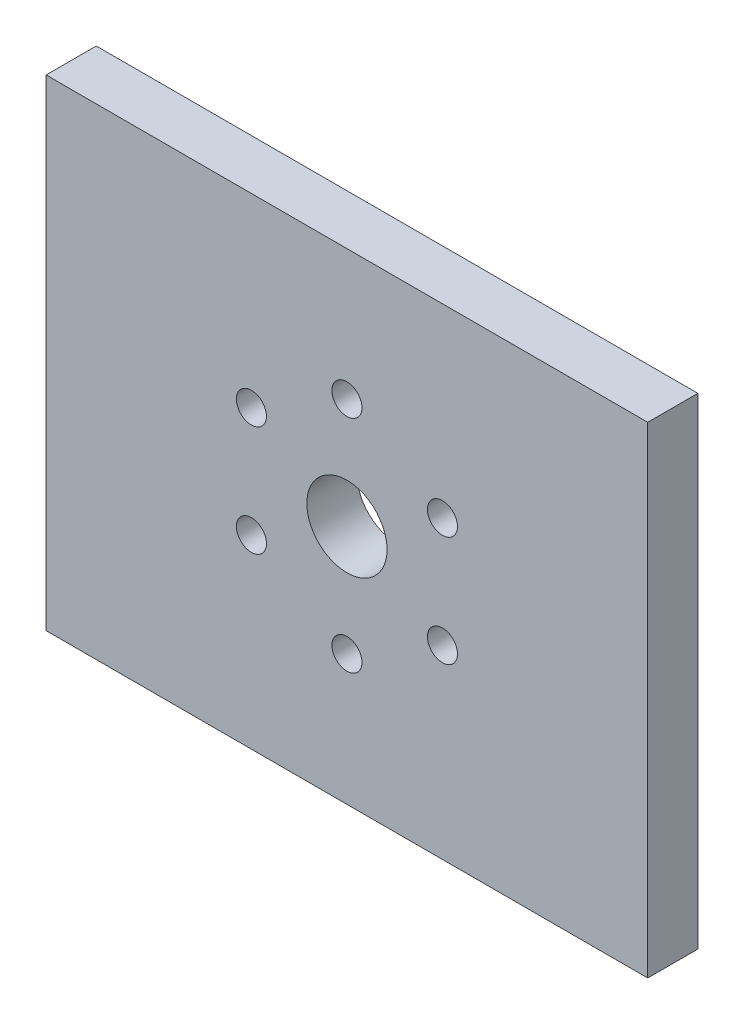
ISO-10303-21;
HEADER;
FILE_DESCRIPTION(('STEP AP214'),'2;1');
FILE_NAME('part.step','',(''),(''),'','','');
FILE_SCHEMA(('AUTOMOTIVE_DESIGN { 1 0 10303 214 1 1 1 1 }'));
ENDSEC;
DATA;
#1=APPLICATION_CONTEXT('core data for automotive mechanical design processes');
#2=APPLICATION_PROTOCOL_DEFINITION('international standard','automotive_design',2000,#1);
#3=PRODUCT_CONTEXT('',#1,'mechanical');
#4=PRODUCT('Part','Part','',(#3));
#5=PRODUCT_RELATED_PRODUCT_CATEGORY('part','',(#4));
#6=PRODUCT_DEFINITION_FORMATION('','',#4);
#7=PRODUCT_DEFINITION_CONTEXT('part definition',#1,'design');
#8=PRODUCT_DEFINITION('design','',#6,#7);
#9=PRODUCT_DEFINITION_SHAPE('','',#8);
#10=(LENGTH_UNIT() NAMED_UNIT(*) SI_UNIT(.MILLI.,.METRE.));
#11=(NAMED_UNIT(*) PLANE_ANGLE_UNIT() SI_UNIT($,.RADIAN.));
#12=(NAMED_UNIT(*) SI_UNIT($,.STERADIAN.) SOLID_ANGLE_UNIT());
#13=UNCERTAINTY_MEASURE_WITH_UNIT(LENGTH_MEASURE(1.E-05),#10,'distance_accuracy_value','');
#14=(GEOMETRIC_REPRESENTATION_CONTEXT(3) GLOBAL_UNCERTAINTY_ASSIGNED_CONTEXT((#13)) GLOBAL_UNIT_ASSIGNED_CONTEXT((#10,
#11,#12)) REPRESENTATION_CONTEXT('',''));
#15=CARTESIAN_POINT('',(0.,0.,0.));
#16=DIRECTION('',(0.,0.,1.));
#17=DIRECTION('',(1.,0.,0.));
#18=AXIS2_PLACEMENT_3D('',#15,#16,#17);
#19=CARTESIAN_POINT('',(0.,0.,5.));
#20=DIRECTION('',(0.,0.,-1.));
#21=DIRECTION('',(-1.,0.,0.));
#22=AXIS2_PLACEMENT_3D('',#19,#20,#21);
#23=PLANE('',#22);
#24=DIRECTION('',(0.,-1.,0.));
#25=VECTOR('',#24,1.);
#26=CARTESIAN_POINT('',(-30.,0.,5.));
#27=LINE('',#26,#25);
#28=CARTESIAN_POINT('',(-30.,48.,5.));
#29=VERTEX_POINT('',#28);
#30=CARTESIAN_POINT('',(-30.,0.,5.));
#31=VERTEX_POINT('',#30);
#32=EDGE_CURVE('E98',#29,#31,#27,.T.);
#33=ORIENTED_EDGE('',*,*,#32,.T.);
#34=DIRECTION('',(1.,0.,0.));
#35=VECTOR('',#34,1.);
#36=CARTESIAN_POINT('',(30.,0.,5.));
#37=LINE('',#36,#35);
#38=CARTESIAN_POINT('',(30.,0.,5.));
#39=VERTEX_POINT('',#38);
#40=EDGE_CURVE('E93',#31,#39,#37,.T.);
#41=ORIENTED_EDGE('',*,*,#40,.T.);
#42=DIRECTION('',(0.,1.,0.));
#43=VECTOR('',#42,1.);
#44=CARTESIAN_POINT('',(30.,0.,5.));
#45=LINE('',#44,#43);
#46=CARTESIAN_POINT('',(30.,48.,5.));
#47=VERTEX_POINT('',#46);
#48=EDGE_CURVE('E96',#39,#47,#45,.T.);
#49=ORIENTED_EDGE('',*,*,#48,.T.);
#50=DIRECTION('',(-1.,0.,0.));
#51=VECTOR('',#50,1.);
#52=CARTESIAN_POINT('',(-30.,48.,5.));
#53=LINE('',#52,#51);
#54=EDGE_CURVE('E63',#47,#29,#53,.T.);
#55=ORIENTED_EDGE('',*,*,#54,.T.);
#56=EDGE_LOOP('',(#33,#41,#49,#55));
#57=FACE_BOUND('',#56,.T.);
#58=CARTESIAN_POINT('',(0.,24.,5.));
#59=DIRECTION('',(0.,0.,1.));
#60=DIRECTION('',(1.,0.,0.));
#61=AXIS2_PLACEMENT_3D('',#58,#59,#60);
#62=CIRCLE('',#61,4.);
#63=CARTESIAN_POINT('',(4.,24.,5.));
#64=VERTEX_POINT('',#63);
#65=EDGE_CURVE('E118',#64,#64,#62,.T.);
#66=ORIENTED_EDGE('',*,*,#65,.F.);
#67=EDGE_LOOP('',(#66));
#68=FACE_BOUND('',#67,.T.);
#69=CARTESIAN_POINT('',(0.,35.,5.));
#70=DIRECTION('',(0.,0.,1.));
#71=DIRECTION('',(1.,0.,0.));
#72=AXIS2_PLACEMENT_3D('',#69,#70,#71);
#73=CIRCLE('',#72,1.5);
#74=CARTESIAN_POINT('',(1.5,35.,5.));
#75=VERTEX_POINT('',#74);
#76=EDGE_CURVE('E140',#75,#75,#73,.T.);
#77=ORIENTED_EDGE('',*,*,#76,.F.);
#78=EDGE_LOOP('',(#77));
#79=FACE_BOUND('',#78,.T.);
#80=CARTESIAN_POINT('',(9.52627944162884,29.5,5.));
#81=DIRECTION('',(0.,0.,1.));
#82=DIRECTION('',(1.,0.,0.));
#83=AXIS2_PLACEMENT_3D('',#80,#81,#82);
#84=CIRCLE('',#83,1.5);
#85=CARTESIAN_POINT('',(11.0262794416288,29.5,5.));
#86=VERTEX_POINT('',#85);
#87=EDGE_CURVE('E148',#86,#86,#84,.T.);
#88=ORIENTED_EDGE('',*,*,#87,.F.);
#89=EDGE_LOOP('',(#88));
#90=FACE_BOUND('',#89,.T.);
#91=CARTESIAN_POINT('',(9.52627944162881,18.5,5.));
#92=DIRECTION('',(0.,0.,1.));
#93=DIRECTION('',(1.,0.,0.));
#94=AXIS2_PLACEMENT_3D('',#91,#92,#93);
#95=CIRCLE('',#94,1.5);
#96=CARTESIAN_POINT('',(11.0262794416288,18.5,5.));
#97=VERTEX_POINT('',#96);
#98=EDGE_CURVE('E156',#97,#97,#95,.T.);
#99=ORIENTED_EDGE('',*,*,#98,.F.);
#100=EDGE_LOOP('',(#99));
#101=FACE_BOUND('',#100,.T.);
#102=CARTESIAN_POINT('',(0.,13.,5.));
#103=DIRECTION('',(0.,0.,1.));
#104=DIRECTION('',(1.,0.,0.));
#105=AXIS2_PLACEMENT_3D('',#102,#103,#104);
#106=CIRCLE('',#105,1.5);
#107=CARTESIAN_POINT('',(1.49999999999994,13.,5.));
#108=VERTEX_POINT('',#107);
#109=EDGE_CURVE('E164',#108,#108,#106,.T.);
#110=ORIENTED_EDGE('',*,*,#109,.F.);
#111=EDGE_LOOP('',(#110));
#112=FACE_BOUND('',#111,.T.);
#113=CARTESIAN_POINT('',(-9.52627944162886,18.5000000000001,5.));
#114=DIRECTION('',(0.,0.,1.));
#115=DIRECTION('',(1.,0.,0.));
#116=AXIS2_PLACEMENT_3D('',#113,#114,#115);
#117=CIRCLE('',#116,1.5);
#118=CARTESIAN_POINT('',(-8.02627944162886,18.5000000000001,5.));
#119=VERTEX_POINT('',#118);
#120=EDGE_CURVE('E172',#119,#119,#117,.T.);
#121=ORIENTED_EDGE('',*,*,#120,.F.);
#122=EDGE_LOOP('',(#121));
#123=FACE_BOUND('',#122,.T.);
#124=CARTESIAN_POINT('',(-9.52627944162875,29.5000000000001,5.));
#125=DIRECTION('',(0.,0.,1.));
#126=DIRECTION('',(1.,0.,0.));
#127=AXIS2_PLACEMENT_3D('',#124,#125,#126);
#128=CIRCLE('',#127,1.5);
#129=CARTESIAN_POINT('',(-8.02627944162875,29.5000000000001,5.));
#130=VERTEX_POINT('',#129);
#131=EDGE_CURVE('E180',#130,#130,#128,.T.);
#132=ORIENTED_EDGE('',*,*,#131,.F.);
#133=EDGE_LOOP('',(#132));
#134=FACE_BOUND('',#133,.T.);
#135=ADVANCED_FACE('F45',(#57,#68,#79,#90,#101,#112,#123,#134),#23,.F.);
#136=CARTESIAN_POINT('',(0.,0.,0.));
#137=DIRECTION('',(0.,0.,-1.));
#138=DIRECTION('',(-1.,0.,0.));
#139=AXIS2_PLACEMENT_3D('',#136,#137,#138);
#140=PLANE('',#139);
#141=CARTESIAN_POINT('',(-9.52627944162886,18.5000000000001,0.));
#142=DIRECTION('',(0.,0.,1.));
#143=DIRECTION('',(1.,0.,0.));
#144=AXIS2_PLACEMENT_3D('',#141,#142,#143);
#145=CIRCLE('',#144,1.5);
#146=CARTESIAN_POINT('',(-8.02627944162886,18.5000000000001,0.));
#147=VERTEX_POINT('',#146);
#148=EDGE_CURVE('E176',#147,#147,#145,.T.);
#149=ORIENTED_EDGE('',*,*,#148,.T.);
#150=EDGE_LOOP('',(#149));
#151=FACE_BOUND('',#150,.T.);
#152=CARTESIAN_POINT('',(9.52627944162881,18.5,0.));
#153=DIRECTION('',(0.,0.,1.));
#154=DIRECTION('',(1.,0.,0.));
#155=AXIS2_PLACEMENT_3D('',#152,#153,#154);
#156=CIRCLE('',#155,1.5);
#157=CARTESIAN_POINT('',(11.0262794416288,18.5,0.));
#158=VERTEX_POINT('',#157);
#159=EDGE_CURVE('E160',#158,#158,#156,.T.);
#160=ORIENTED_EDGE('',*,*,#159,.T.);
#161=EDGE_LOOP('',(#160));
#162=FACE_BOUND('',#161,.T.);
#163=CARTESIAN_POINT('',(0.,35.,0.));
#164=DIRECTION('',(0.,0.,1.));
#165=DIRECTION('',(1.,0.,0.));
#166=AXIS2_PLACEMENT_3D('',#163,#164,#165);
#167=CIRCLE('',#166,1.5);
#168=CARTESIAN_POINT('',(1.5,35.,0.));
#169=VERTEX_POINT('',#168);
#170=EDGE_CURVE('E144',#169,#169,#167,.T.);
#171=ORIENTED_EDGE('',*,*,#170,.T.);
#172=EDGE_LOOP('',(#171));
#173=FACE_BOUND('',#172,.T.);
#174=DIRECTION('',(0.,-1.,0.));
#175=VECTOR('',#174,1.);
#176=CARTESIAN_POINT('',(-30.,0.,0.));
#177=LINE('',#176,#175);
#178=CARTESIAN_POINT('',(-30.,48.,0.));
#179=VERTEX_POINT('',#178);
#180=CARTESIAN_POINT('',(-30.,0.,0.));
#181=VERTEX_POINT('',#180);
#182=EDGE_CURVE('E114',#179,#181,#177,.T.);
#183=ORIENTED_EDGE('',*,*,#182,.F.);
#184=DIRECTION('',(-1.,0.,0.));
#185=VECTOR('',#184,1.);
#186=CARTESIAN_POINT('',(-30.,48.,0.));
#187=LINE('',#186,#185);
#188=CARTESIAN_POINT('',(30.,48.,0.));
#189=VERTEX_POINT('',#188);
#190=EDGE_CURVE('E86',#189,#179,#187,.T.);
#191=ORIENTED_EDGE('',*,*,#190,.F.);
#192=DIRECTION('',(0.,1.,0.));
#193=VECTOR('',#192,1.);
#194=CARTESIAN_POINT('',(30.,0.,0.));
#195=LINE('',#194,#193);
#196=CARTESIAN_POINT('',(30.,0.,0.));
#197=VERTEX_POINT('',#196);
#198=EDGE_CURVE('E80',#197,#189,#195,.T.);
#199=ORIENTED_EDGE('',*,*,#198,.F.);
#200=DIRECTION('',(1.,0.,0.));
#201=VECTOR('',#200,1.);
#202=CARTESIAN_POINT('',(30.,0.,0.));
#203=LINE('',#202,#201);
#204=EDGE_CURVE('E103',#181,#197,#203,.T.);
#205=ORIENTED_EDGE('',*,*,#204,.F.);
#206=EDGE_LOOP('',(#183,#191,#199,#205));
#207=FACE_BOUND('',#206,.T.);
#208=CARTESIAN_POINT('',(0.,24.,0.));
#209=DIRECTION('',(0.,0.,1.));
#210=DIRECTION('',(1.,0.,0.));
#211=AXIS2_PLACEMENT_3D('',#208,#209,#210);
#212=CIRCLE('',#211,4.);
#213=CARTESIAN_POINT('',(4.,24.,0.));
#214=VERTEX_POINT('',#213);
#215=EDGE_CURVE('E136',#214,#214,#212,.T.);
#216=ORIENTED_EDGE('',*,*,#215,.T.);
#217=EDGE_LOOP('',(#216));
#218=FACE_BOUND('',#217,.T.);
#219=CARTESIAN_POINT('',(9.52627944162884,29.5,0.));
#220=DIRECTION('',(0.,0.,1.));
#221=DIRECTION('',(1.,0.,0.));
#222=AXIS2_PLACEMENT_3D('',#219,#220,#221);
#223=CIRCLE('',#222,1.5);
#224=CARTESIAN_POINT('',(11.0262794416288,29.5,0.));
#225=VERTEX_POINT('',#224);
#226=EDGE_CURVE('E152',#225,#225,#223,.T.);
#227=ORIENTED_EDGE('',*,*,#226,.T.);
#228=EDGE_LOOP('',(#227));
#229=FACE_BOUND('',#228,.T.);
#230=CARTESIAN_POINT('',(0.,13.,0.));
#231=DIRECTION('',(0.,0.,1.));
#232=DIRECTION('',(1.,0.,0.));
#233=AXIS2_PLACEMENT_3D('',#230,#231,#232);
#234=CIRCLE('',#233,1.5);
#235=CARTESIAN_POINT('',(1.49999999999994,13.,0.));
#236=VERTEX_POINT('',#235);
#237=EDGE_CURVE('E168',#236,#236,#234,.T.);
#238=ORIENTED_EDGE('',*,*,#237,.T.);
#239=EDGE_LOOP('',(#238));
#240=FACE_BOUND('',#239,.T.);
#241=CARTESIAN_POINT('',(-9.52627944162875,29.5000000000001,0.));
#242=DIRECTION('',(0.,0.,1.));
#243=DIRECTION('',(1.,0.,0.));
#244=AXIS2_PLACEMENT_3D('',#241,#242,#243);
#245=CIRCLE('',#244,1.5);
#246=CARTESIAN_POINT('',(-8.02627944162875,29.5000000000001,0.));
#247=VERTEX_POINT('',#246);
#248=EDGE_CURVE('E184',#247,#247,#245,.T.);
#249=ORIENTED_EDGE('',*,*,#248,.T.);
#250=EDGE_LOOP('',(#249));
#251=FACE_BOUND('',#250,.T.);
#252=ADVANCED_FACE('F131',(#151,#162,#173,#207,#218,#229,#240,#251),#140,.T.);
#253=CARTESIAN_POINT('',(-30.,0.,5.));
#254=DIRECTION('',(1.,0.,0.));
#255=DIRECTION('',(0.,0.,-1.));
#256=AXIS2_PLACEMENT_3D('',#253,#254,#255);
#257=PLANE('',#256);
#258=ORIENTED_EDGE('',*,*,#182,.T.);
#259=DIRECTION('',(0.,0.,-1.));
#260=VECTOR('',#259,1.);
#261=CARTESIAN_POINT('',(-30.,0.,5.));
#262=LINE('',#261,#260);
#263=EDGE_CURVE('E11',#31,#181,#262,.T.);
#264=ORIENTED_EDGE('',*,*,#263,.F.);
#265=ORIENTED_EDGE('',*,*,#32,.F.);
#266=DIRECTION('',(0.,0.,-1.));
#267=VECTOR('',#266,1.);
#268=CARTESIAN_POINT('',(-30.,48.,5.));
#269=LINE('',#268,#267);
#270=EDGE_CURVE('E110',#29,#179,#269,.T.);
#271=ORIENTED_EDGE('',*,*,#270,.T.);
#272=EDGE_LOOP('',(#258,#264,#265,#271));
#273=FACE_BOUND('',#272,.T.);
#274=ADVANCED_FACE('F47',(#273),#257,.F.);
#275=CARTESIAN_POINT('',(30.,0.,5.));
#276=DIRECTION('',(0.,1.,0.));
#277=DIRECTION('',(0.,0.,1.));
#278=AXIS2_PLACEMENT_3D('',#275,#276,#277);
#279=PLANE('',#278);
#280=ORIENTED_EDGE('',*,*,#204,.T.);
#281=DIRECTION('',(0.,0.,-1.));
#282=VECTOR('',#281,1.);
#283=CARTESIAN_POINT('',(30.,0.,5.));
#284=LINE('',#283,#282);
#285=EDGE_CURVE('E55',#39,#197,#284,.T.);
#286=ORIENTED_EDGE('',*,*,#285,.F.);
#287=ORIENTED_EDGE('',*,*,#40,.F.);
#288=ORIENTED_EDGE('',*,*,#263,.T.);
#289=EDGE_LOOP('',(#280,#286,#287,#288));
#290=FACE_BOUND('',#289,.T.);
#291=ADVANCED_FACE('F102',(#290),#279,.F.);
#292=CARTESIAN_POINT('',(30.,0.,5.));
#293=DIRECTION('',(-1.,0.,0.));
#294=DIRECTION('',(0.,0.,1.));
#295=AXIS2_PLACEMENT_3D('',#292,#293,#294);
#296=PLANE('',#295);
#297=ORIENTED_EDGE('',*,*,#198,.T.);
#298=DIRECTION('',(0.,0.,-1.));
#299=VECTOR('',#298,1.);
#300=CARTESIAN_POINT('',(30.,48.,5.));
#301=LINE('',#300,#299);
#302=EDGE_CURVE('E105',#47,#189,#301,.T.);
#303=ORIENTED_EDGE('',*,*,#302,.F.);
#304=ORIENTED_EDGE('',*,*,#48,.F.);
#305=ORIENTED_EDGE('',*,*,#285,.T.);
#306=EDGE_LOOP('',(#297,#303,#304,#305));
#307=FACE_BOUND('',#306,.T.);
#308=ADVANCED_FACE('F106',(#307),#296,.F.);
#309=CARTESIAN_POINT('',(-30.,48.,5.));
#310=DIRECTION('',(0.,-1.,0.));
#311=DIRECTION('',(0.,0.,-1.));
#312=AXIS2_PLACEMENT_3D('',#309,#310,#311);
#313=PLANE('',#312);
#314=ORIENTED_EDGE('',*,*,#190,.T.);
#315=ORIENTED_EDGE('',*,*,#270,.F.);
#316=ORIENTED_EDGE('',*,*,#54,.F.);
#317=ORIENTED_EDGE('',*,*,#302,.T.);
#318=EDGE_LOOP('',(#314,#315,#316,#317));
#319=FACE_BOUND('',#318,.T.);
#320=ADVANCED_FACE('F128',(#319),#313,.F.);
#321=CARTESIAN_POINT('',(0.,24.,5.));
#322=DIRECTION('',(0.,0.,-1.));
#323=DIRECTION('',(-1.,0.,0.));
#324=AXIS2_PLACEMENT_3D('',#321,#322,#323);
#325=CYLINDRICAL_SURFACE('',#324,4.);
#326=ORIENTED_EDGE('',*,*,#65,.T.);
#327=EDGE_LOOP('',(#326));
#328=FACE_BOUND('',#327,.T.);
#329=ORIENTED_EDGE('',*,*,#215,.F.);
#330=EDGE_LOOP('',(#329));
#331=FACE_BOUND('',#330,.T.);
#332=ADVANCED_FACE('F203',(#328,#331),#325,.F.);
#333=CARTESIAN_POINT('',(0.,35.,5.));
#334=DIRECTION('',(0.,0.,-1.));
#335=DIRECTION('',(-1.,0.,0.));
#336=AXIS2_PLACEMENT_3D('',#333,#334,#335);
#337=CYLINDRICAL_SURFACE('',#336,1.5);
#338=ORIENTED_EDGE('',*,*,#76,.T.);
#339=EDGE_LOOP('',(#338));
#340=FACE_BOUND('',#339,.T.);
#341=ORIENTED_EDGE('',*,*,#170,.F.);
#342=EDGE_LOOP('',(#341));
#343=FACE_BOUND('',#342,.T.);
#344=ADVANCED_FACE('F248',(#340,#343),#337,.F.);
#345=CARTESIAN_POINT('',(9.52627944162884,29.5,5.));
#346=DIRECTION('',(0.,0.,-1.));
#347=DIRECTION('',(-1.,0.,0.));
#348=AXIS2_PLACEMENT_3D('',#345,#346,#347);
#349=CYLINDRICAL_SURFACE('',#348,1.5);
#350=ORIENTED_EDGE('',*,*,#87,.T.);
#351=EDGE_LOOP('',(#350));
#352=FACE_BOUND('',#351,.T.);
#353=ORIENTED_EDGE('',*,*,#226,.F.);
#354=EDGE_LOOP('',(#353));
#355=FACE_BOUND('',#354,.T.);
#356=ADVANCED_FACE('F256',(#352,#355),#349,.F.);
#357=CARTESIAN_POINT('',(9.52627944162881,18.5,5.));
#358=DIRECTION('',(0.,0.,-1.));
#359=DIRECTION('',(-1.,0.,0.));
#360=AXIS2_PLACEMENT_3D('',#357,#358,#359);
#361=CYLINDRICAL_SURFACE('',#360,1.5);
#362=ORIENTED_EDGE('',*,*,#98,.T.);
#363=EDGE_LOOP('',(#362));
#364=FACE_BOUND('',#363,.T.);
#365=ORIENTED_EDGE('',*,*,#159,.F.);
#366=EDGE_LOOP('',(#365));
#367=FACE_BOUND('',#366,.T.);
#368=ADVANCED_FACE('F264',(#364,#367),#361,.F.);
#369=CARTESIAN_POINT('',(0.,13.,5.));
#370=DIRECTION('',(0.,0.,-1.));
#371=DIRECTION('',(-1.,0.,0.));
#372=AXIS2_PLACEMENT_3D('',#369,#370,#371);
#373=CYLINDRICAL_SURFACE('',#372,1.5);
#374=ORIENTED_EDGE('',*,*,#109,.T.);
#375=EDGE_LOOP('',(#374));
#376=FACE_BOUND('',#375,.T.);
#377=ORIENTED_EDGE('',*,*,#237,.F.);
#378=EDGE_LOOP('',(#377));
#379=FACE_BOUND('',#378,.T.);
#380=ADVANCED_FACE('F273',(#376,#379),#373,.F.);
#381=CARTESIAN_POINT('',(-9.52627944162886,18.5000000000001,5.));
#382=DIRECTION('',(0.,0.,-1.));
#383=DIRECTION('',(-1.,0.,0.));
#384=AXIS2_PLACEMENT_3D('',#381,#382,#383);
#385=CYLINDRICAL_SURFACE('',#384,1.5);
#386=ORIENTED_EDGE('',*,*,#120,.T.);
#387=EDGE_LOOP('',(#386));
#388=FACE_BOUND('',#387,.T.);
#389=ORIENTED_EDGE('',*,*,#148,.F.);
#390=EDGE_LOOP('',(#389));
#391=FACE_BOUND('',#390,.T.);
#392=ADVANCED_FACE('F282',(#388,#391),#385,.F.);
#393=CARTESIAN_POINT('',(-9.52627944162875,29.5000000000001,5.));
#394=DIRECTION('',(0.,0.,-1.));
#395=DIRECTION('',(-1.,0.,0.));
#396=AXIS2_PLACEMENT_3D('',#393,#394,#395);
#397=CYLINDRICAL_SURFACE('',#396,1.5);
#398=ORIENTED_EDGE('',*,*,#131,.T.);
#399=EDGE_LOOP('',(#398));
#400=FACE_BOUND('',#399,.T.);
#401=ORIENTED_EDGE('',*,*,#248,.F.);
#402=EDGE_LOOP('',(#401));
#403=FACE_BOUND('',#402,.T.);
#404=ADVANCED_FACE('F192',(#400,#403),#397,.F.);
#405=CLOSED_SHELL('',(#135,#252,#274,#291,#308,#320,#332,#344,#356,#368,#380,#392,#404));
#406=MANIFOLD_SOLID_BREP('B2',#405);
#407=ADVANCED_BREP_SHAPE_REPRESENTATION('',(#18,#406),#14);
#408=SHAPE_DEFINITION_REPRESENTATION(#9,#407);
ENDSEC;
END-ISO-10303-21;
